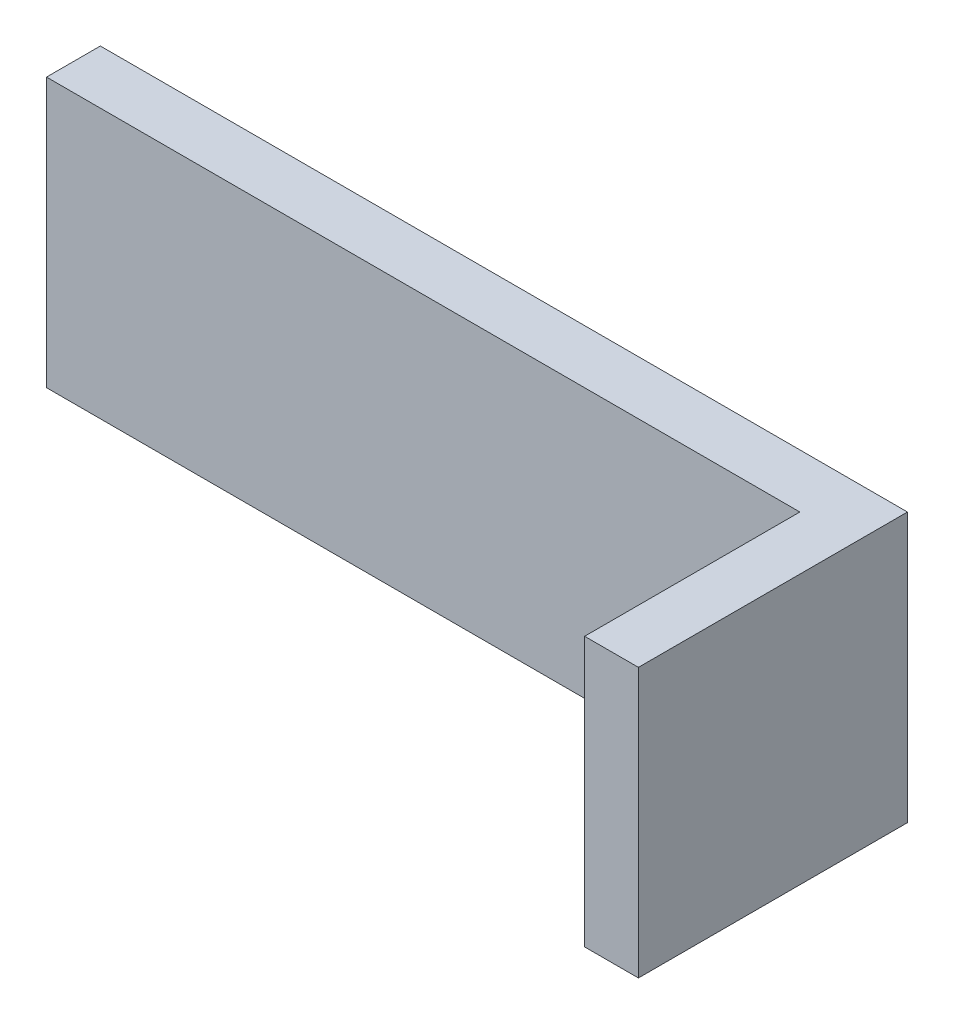
ISO-10303-21;
HEADER;
FILE_DESCRIPTION(('STEP AP214'),'2;1');
FILE_NAME('part.step','',(''),(''),'','','');
FILE_SCHEMA(('AUTOMOTIVE_DESIGN { 1 0 10303 214 1 1 1 1 }'));
ENDSEC;
DATA;
#1=APPLICATION_CONTEXT('core data for automotive mechanical design processes');
#2=APPLICATION_PROTOCOL_DEFINITION('international standard','automotive_design',2000,#1);
#3=PRODUCT_CONTEXT('',#1,'mechanical');
#4=PRODUCT('Part','Part','',(#3));
#5=PRODUCT_RELATED_PRODUCT_CATEGORY('part','',(#4));
#6=PRODUCT_DEFINITION_FORMATION('','',#4);
#7=PRODUCT_DEFINITION_CONTEXT('part definition',#1,'design');
#8=PRODUCT_DEFINITION('design','',#6,#7);
#9=PRODUCT_DEFINITION_SHAPE('','',#8);
#10=(LENGTH_UNIT() NAMED_UNIT(*) SI_UNIT(.MILLI.,.METRE.));
#11=(NAMED_UNIT(*) PLANE_ANGLE_UNIT() SI_UNIT($,.RADIAN.));
#12=(NAMED_UNIT(*) SI_UNIT($,.STERADIAN.) SOLID_ANGLE_UNIT());
#13=UNCERTAINTY_MEASURE_WITH_UNIT(LENGTH_MEASURE(1.E-05),#10,'distance_accuracy_value','');
#14=(GEOMETRIC_REPRESENTATION_CONTEXT(3) GLOBAL_UNCERTAINTY_ASSIGNED_CONTEXT((#13)) GLOBAL_UNIT_ASSIGNED_CONTEXT((#10,
#11,#12)) REPRESENTATION_CONTEXT('',''));
#15=CARTESIAN_POINT('',(0.,0.,0.));
#16=DIRECTION('',(0.,0.,1.));
#17=DIRECTION('',(1.,0.,0.));
#18=AXIS2_PLACEMENT_3D('',#15,#16,#17);
#19=CARTESIAN_POINT('',(-75.,-25.,50.));
#20=DIRECTION('',(1.,0.,0.));
#21=DIRECTION('',(0.,0.,-1.));
#22=AXIS2_PLACEMENT_3D('',#19,#20,#21);
#23=PLANE('',#22);
#24=DIRECTION('',(0.,0.,-1.));
#25=VECTOR('',#24,1.);
#26=CARTESIAN_POINT('',(-75.,-25.,50.));
#27=LINE('',#26,#25);
#28=CARTESIAN_POINT('',(-75.,-25.,10.));
#29=VERTEX_POINT('',#28);
#30=CARTESIAN_POINT('',(-75.,-25.,0.));
#31=VERTEX_POINT('',#30);
#32=EDGE_CURVE('E11',#29,#31,#27,.T.);
#33=ORIENTED_EDGE('',*,*,#32,.F.);
#34=DIRECTION('',(0.,-1.,0.));
#35=VECTOR('',#34,1.);
#36=CARTESIAN_POINT('',(-75.,25.,10.));
#37=LINE('',#36,#35);
#38=CARTESIAN_POINT('',(-75.,25.,10.));
#39=VERTEX_POINT('',#38);
#40=EDGE_CURVE('E81',#39,#29,#37,.T.);
#41=ORIENTED_EDGE('',*,*,#40,.F.);
#42=DIRECTION('',(0.,0.,-1.));
#43=VECTOR('',#42,1.);
#44=CARTESIAN_POINT('',(-75.,25.,50.));
#45=LINE('',#44,#43);
#46=CARTESIAN_POINT('',(-75.,25.,0.));
#47=VERTEX_POINT('',#46);
#48=EDGE_CURVE('E74',#39,#47,#45,.T.);
#49=ORIENTED_EDGE('',*,*,#48,.T.);
#50=DIRECTION('',(0.,-1.,0.));
#51=VECTOR('',#50,1.);
#52=CARTESIAN_POINT('',(-75.,-25.,0.));
#53=LINE('',#52,#51);
#54=EDGE_CURVE('E78',#47,#31,#53,.T.);
#55=ORIENTED_EDGE('',*,*,#54,.T.);
#56=EDGE_LOOP('',(#33,#41,#49,#55));
#57=FACE_BOUND('',#56,.T.);
#58=ADVANCED_FACE('F32',(#57),#23,.F.);
#59=CARTESIAN_POINT('',(75.,-25.,50.));
#60=DIRECTION('',(0.,1.,0.));
#61=DIRECTION('',(-1.,0.,0.));
#62=AXIS2_PLACEMENT_3D('',#59,#60,#61);
#63=PLANE('',#62);
#64=DIRECTION('',(1.,0.,0.));
#65=VECTOR('',#64,1.);
#66=CARTESIAN_POINT('',(75.,-25.,50.));
#67=LINE('',#66,#65);
#68=CARTESIAN_POINT('',(65.,-25.,50.));
#69=VERTEX_POINT('',#68);
#70=CARTESIAN_POINT('',(75.,-25.,50.));
#71=VERTEX_POINT('',#70);
#72=EDGE_CURVE('E94',#69,#71,#67,.T.);
#73=ORIENTED_EDGE('',*,*,#72,.F.);
#74=DIRECTION('',(0.,0.,1.));
#75=VECTOR('',#74,1.);
#76=CARTESIAN_POINT('',(65.,-25.,50.));
#77=LINE('',#76,#75);
#78=CARTESIAN_POINT('',(65.,-25.,10.));
#79=VERTEX_POINT('',#78);
#80=EDGE_CURVE('E46',#79,#69,#77,.T.);
#81=ORIENTED_EDGE('',*,*,#80,.F.);
#82=DIRECTION('',(1.,0.,0.));
#83=VECTOR('',#82,1.);
#84=CARTESIAN_POINT('',(-75.,-25.,10.));
#85=LINE('',#84,#83);
#86=EDGE_CURVE('E119',#29,#79,#85,.T.);
#87=ORIENTED_EDGE('',*,*,#86,.F.);
#88=ORIENTED_EDGE('',*,*,#32,.T.);
#89=DIRECTION('',(1.,0.,0.));
#90=VECTOR('',#89,1.);
#91=CARTESIAN_POINT('',(75.,-25.,0.));
#92=LINE('',#91,#90);
#93=CARTESIAN_POINT('',(75.,-25.,0.));
#94=VERTEX_POINT('',#93);
#95=EDGE_CURVE('E99',#31,#94,#92,.T.);
#96=ORIENTED_EDGE('',*,*,#95,.T.);
#97=DIRECTION('',(0.,0.,-1.));
#98=VECTOR('',#97,1.);
#99=CARTESIAN_POINT('',(75.,-25.,50.));
#100=LINE('',#99,#98);
#101=EDGE_CURVE('E39',#71,#94,#100,.T.);
#102=ORIENTED_EDGE('',*,*,#101,.F.);
#103=EDGE_LOOP('',(#73,#81,#87,#88,#96,#102));
#104=FACE_BOUND('',#103,.T.);
#105=ADVANCED_FACE('F115',(#104),#63,.F.);
#106=CARTESIAN_POINT('',(75.,-25.,50.));
#107=DIRECTION('',(-1.,0.,0.));
#108=DIRECTION('',(0.,0.,1.));
#109=AXIS2_PLACEMENT_3D('',#106,#107,#108);
#110=PLANE('',#109);
#111=DIRECTION('',(0.,1.,0.));
#112=VECTOR('',#111,1.);
#113=CARTESIAN_POINT('',(75.,-25.,0.));
#114=LINE('',#113,#112);
#115=CARTESIAN_POINT('',(75.,25.,0.));
#116=VERTEX_POINT('',#115);
#117=EDGE_CURVE('E95',#94,#116,#114,.T.);
#118=ORIENTED_EDGE('',*,*,#117,.T.);
#119=DIRECTION('',(0.,0.,-1.));
#120=VECTOR('',#119,1.);
#121=CARTESIAN_POINT('',(75.,25.,50.));
#122=LINE('',#121,#120);
#123=CARTESIAN_POINT('',(75.,25.,50.));
#124=VERTEX_POINT('',#123);
#125=EDGE_CURVE('E84',#124,#116,#122,.T.);
#126=ORIENTED_EDGE('',*,*,#125,.F.);
#127=DIRECTION('',(0.,1.,0.));
#128=VECTOR('',#127,1.);
#129=CARTESIAN_POINT('',(75.,-25.,50.));
#130=LINE('',#129,#128);
#131=EDGE_CURVE('E55',#71,#124,#130,.T.);
#132=ORIENTED_EDGE('',*,*,#131,.F.);
#133=ORIENTED_EDGE('',*,*,#101,.T.);
#134=EDGE_LOOP('',(#118,#126,#132,#133));
#135=FACE_BOUND('',#134,.T.);
#136=ADVANCED_FACE('F112',(#135),#110,.F.);
#137=CARTESIAN_POINT('',(75.,25.,50.));
#138=DIRECTION('',(0.,-1.,0.));
#139=DIRECTION('',(1.,0.,0.));
#140=AXIS2_PLACEMENT_3D('',#137,#138,#139);
#141=PLANE('',#140);
#142=DIRECTION('',(1.,0.,0.));
#143=VECTOR('',#142,1.);
#144=CARTESIAN_POINT('',(-75.,25.,10.));
#145=LINE('',#144,#143);
#146=CARTESIAN_POINT('',(65.,25.,10.));
#147=VERTEX_POINT('',#146);
#148=EDGE_CURVE('E129',#39,#147,#145,.T.);
#149=ORIENTED_EDGE('',*,*,#148,.T.);
#150=DIRECTION('',(0.,0.,1.));
#151=VECTOR('',#150,1.);
#152=CARTESIAN_POINT('',(65.,25.,50.));
#153=LINE('',#152,#151);
#154=CARTESIAN_POINT('',(65.,25.,50.));
#155=VERTEX_POINT('',#154);
#156=EDGE_CURVE('E133',#147,#155,#153,.T.);
#157=ORIENTED_EDGE('',*,*,#156,.T.);
#158=DIRECTION('',(-1.,0.,0.));
#159=VECTOR('',#158,1.);
#160=CARTESIAN_POINT('',(75.,25.,50.));
#161=LINE('',#160,#159);
#162=EDGE_CURVE('E85',#124,#155,#161,.T.);
#163=ORIENTED_EDGE('',*,*,#162,.F.);
#164=ORIENTED_EDGE('',*,*,#125,.T.);
#165=DIRECTION('',(-1.,0.,0.));
#166=VECTOR('',#165,1.);
#167=CARTESIAN_POINT('',(75.,25.,0.));
#168=LINE('',#167,#166);
#169=EDGE_CURVE('E89',#116,#47,#168,.T.);
#170=ORIENTED_EDGE('',*,*,#169,.T.);
#171=ORIENTED_EDGE('',*,*,#48,.F.);
#172=EDGE_LOOP('',(#149,#157,#163,#164,#170,#171));
#173=FACE_BOUND('',#172,.T.);
#174=ADVANCED_FACE('F90',(#173),#141,.F.);
#175=CARTESIAN_POINT('',(0.,0.,50.));
#176=DIRECTION('',(0.,0.,1.));
#177=DIRECTION('',(1.,0.,0.));
#178=AXIS2_PLACEMENT_3D('',#175,#176,#177);
#179=PLANE('',#178);
#180=DIRECTION('',(0.,-1.,0.));
#181=VECTOR('',#180,1.);
#182=CARTESIAN_POINT('',(65.,25.,50.));
#183=LINE('',#182,#181);
#184=EDGE_CURVE('E100',#155,#69,#183,.T.);
#185=ORIENTED_EDGE('',*,*,#184,.T.);
#186=ORIENTED_EDGE('',*,*,#72,.T.);
#187=ORIENTED_EDGE('',*,*,#131,.T.);
#188=ORIENTED_EDGE('',*,*,#162,.T.);
#189=EDGE_LOOP('',(#185,#186,#187,#188));
#190=FACE_BOUND('',#189,.T.);
#191=ADVANCED_FACE('F141',(#190),#179,.T.);
#192=CARTESIAN_POINT('',(0.,0.,0.));
#193=DIRECTION('',(0.,0.,1.));
#194=DIRECTION('',(1.,0.,0.));
#195=AXIS2_PLACEMENT_3D('',#192,#193,#194);
#196=PLANE('',#195);
#197=ORIENTED_EDGE('',*,*,#54,.F.);
#198=ORIENTED_EDGE('',*,*,#169,.F.);
#199=ORIENTED_EDGE('',*,*,#117,.F.);
#200=ORIENTED_EDGE('',*,*,#95,.F.);
#201=EDGE_LOOP('',(#197,#198,#199,#200));
#202=FACE_BOUND('',#201,.T.);
#203=ADVANCED_FACE('F98',(#202),#196,.F.);
#204=CARTESIAN_POINT('',(65.,25.,50.));
#205=DIRECTION('',(1.,0.,0.));
#206=DIRECTION('',(0.,1.,0.));
#207=AXIS2_PLACEMENT_3D('',#204,#205,#206);
#208=PLANE('',#207);
#209=ORIENTED_EDGE('',*,*,#80,.T.);
#210=ORIENTED_EDGE('',*,*,#184,.F.);
#211=ORIENTED_EDGE('',*,*,#156,.F.);
#212=DIRECTION('',(0.,-1.,0.));
#213=VECTOR('',#212,1.);
#214=CARTESIAN_POINT('',(65.,25.,10.));
#215=LINE('',#214,#213);
#216=EDGE_CURVE('E103',#147,#79,#215,.T.);
#217=ORIENTED_EDGE('',*,*,#216,.T.);
#218=EDGE_LOOP('',(#209,#210,#211,#217));
#219=FACE_BOUND('',#218,.T.);
#220=ADVANCED_FACE('F142',(#219),#208,.F.);
#221=CARTESIAN_POINT('',(-75.,25.,10.));
#222=DIRECTION('',(0.,0.,-1.));
#223=DIRECTION('',(-1.,0.,0.));
#224=AXIS2_PLACEMENT_3D('',#221,#222,#223);
#225=PLANE('',#224);
#226=ORIENTED_EDGE('',*,*,#86,.T.);
#227=ORIENTED_EDGE('',*,*,#216,.F.);
#228=ORIENTED_EDGE('',*,*,#148,.F.);
#229=ORIENTED_EDGE('',*,*,#40,.T.);
#230=EDGE_LOOP('',(#226,#227,#228,#229));
#231=FACE_BOUND('',#230,.T.);
#232=ADVANCED_FACE('F130',(#231),#225,.F.);
#233=CLOSED_SHELL('',(#58,#105,#136,#174,#191,#203,#220,#232));
#234=MANIFOLD_SOLID_BREP('B2',#233);
#235=ADVANCED_BREP_SHAPE_REPRESENTATION('',(#18,#234),#14);
#236=SHAPE_DEFINITION_REPRESENTATION(#9,#235);
ENDSEC;
END-ISO-10303-21;
